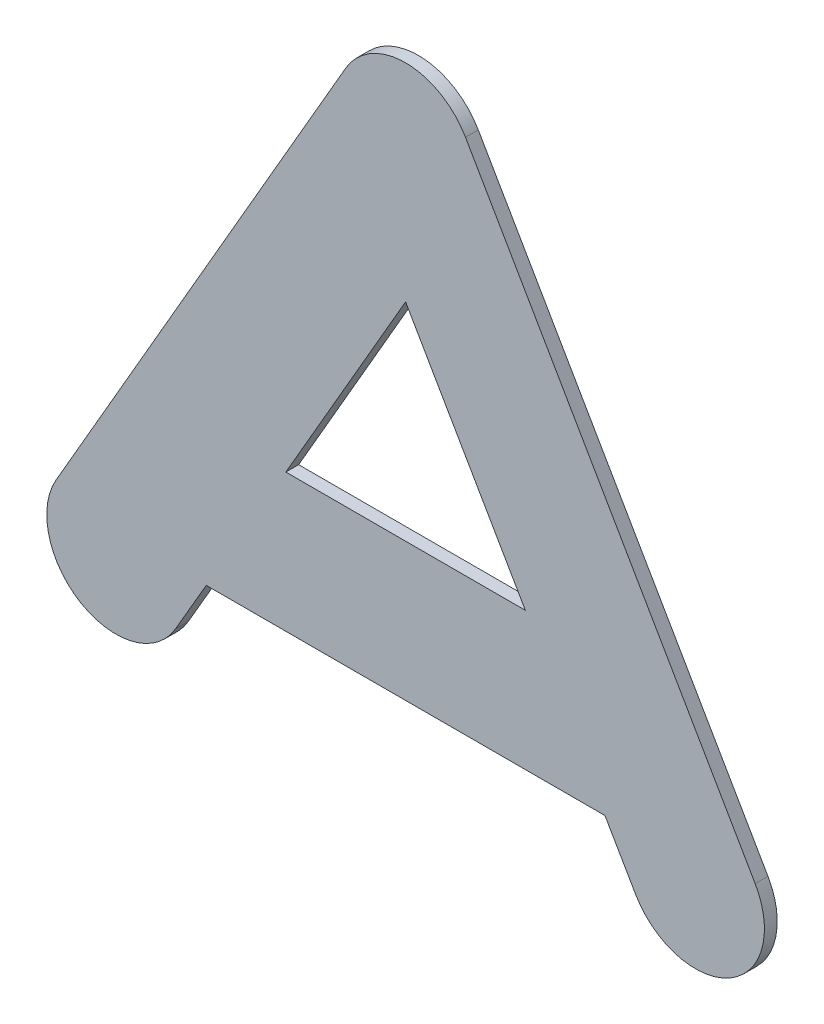
ISO-10303-21;
HEADER;
FILE_DESCRIPTION(('STEP AP214'),'2;1');
FILE_NAME('part.step','',(''),(''),'','','');
FILE_SCHEMA(('AUTOMOTIVE_DESIGN { 1 0 10303 214 1 1 1 1 }'));
ENDSEC;
DATA;
#1=APPLICATION_CONTEXT('core data for automotive mechanical design processes');
#2=APPLICATION_PROTOCOL_DEFINITION('international standard','automotive_design',2000,#1);
#3=PRODUCT_CONTEXT('',#1,'mechanical');
#4=PRODUCT('Part','Part','',(#3));
#5=PRODUCT_RELATED_PRODUCT_CATEGORY('part','',(#4));
#6=PRODUCT_DEFINITION_FORMATION('','',#4);
#7=PRODUCT_DEFINITION_CONTEXT('part definition',#1,'design');
#8=PRODUCT_DEFINITION('design','',#6,#7);
#9=PRODUCT_DEFINITION_SHAPE('','',#8);
#10=(LENGTH_UNIT() NAMED_UNIT(*) SI_UNIT(.MILLI.,.METRE.));
#11=(NAMED_UNIT(*) PLANE_ANGLE_UNIT() SI_UNIT($,.RADIAN.));
#12=(NAMED_UNIT(*) SI_UNIT($,.STERADIAN.) SOLID_ANGLE_UNIT());
#13=UNCERTAINTY_MEASURE_WITH_UNIT(LENGTH_MEASURE(1.E-05),#10,'distance_accuracy_value','');
#14=(GEOMETRIC_REPRESENTATION_CONTEXT(3) GLOBAL_UNCERTAINTY_ASSIGNED_CONTEXT((#13)) GLOBAL_UNIT_ASSIGNED_CONTEXT((#10,
#11,#12)) REPRESENTATION_CONTEXT('',''));
#15=CARTESIAN_POINT('',(0.,0.,0.));
#16=DIRECTION('',(0.,0.,1.));
#17=DIRECTION('',(1.,0.,0.));
#18=AXIS2_PLACEMENT_3D('',#15,#16,#17);
#19=CARTESIAN_POINT('',(0.,0.,0.05));
#20=DIRECTION('',(0.,0.,1.));
#21=DIRECTION('',(1.,0.,0.));
#22=AXIS2_PLACEMENT_3D('',#19,#20,#21);
#23=PLANE('',#22);
#24=DIRECTION('',(0.500277597874586,-0.865865073244576,0.));
#25=VECTOR('',#24,1.);
#26=CARTESIAN_POINT('',(0.,2.698,0.05));
#27=LINE('',#26,#25);
#28=CARTESIAN_POINT('',(0.46799999999999,1.88799999999999,0.05));
#29=VERTEX_POINT('',#28);
#30=CARTESIAN_POINT('',(0.,2.69800000000001,0.05));
#31=VERTEX_POINT('',#30);
#32=EDGE_CURVE('E178',#29,#31,#27,.F.);
#33=ORIENTED_EDGE('',*,*,#32,.F.);
#34=DIRECTION('',(1.,0.,0.));
#35=VECTOR('',#34,1.);
#36=CARTESIAN_POINT('',(0.468,1.888,0.05));
#37=LINE('',#36,#35);
#38=CARTESIAN_POINT('',(-0.468,1.888,0.05));
#39=VERTEX_POINT('',#38);
#40=EDGE_CURVE('E187',#39,#29,#37,.T.);
#41=ORIENTED_EDGE('',*,*,#40,.F.);
#42=DIRECTION('',(0.500277597874586,0.865865073244576,0.));
#43=VECTOR('',#42,1.);
#44=CARTESIAN_POINT('',(-0.468,1.888,0.05));
#45=LINE('',#44,#43);
#46=EDGE_CURVE('E185',#31,#39,#45,.F.);
#47=ORIENTED_EDGE('',*,*,#46,.F.);
#48=EDGE_LOOP('',(#33,#41,#47));
#49=FACE_BOUND('',#48,.T.);
#50=DIRECTION('',(0.501530435631904,0.865140001465007,0.));
#51=VECTOR('',#50,1.);
#52=CARTESIAN_POINT('',(-0.899,1.142,0.05));
#53=LINE('',#52,#51);
#54=CARTESIAN_POINT('',(-0.778999999999998,1.349,0.05));
#55=VERTEX_POINT('',#54);
#56=CARTESIAN_POINT('',(-0.899,1.142,0.05));
#57=VERTEX_POINT('',#56);
#58=EDGE_CURVE('E129',#55,#57,#53,.F.);
#59=ORIENTED_EDGE('',*,*,#58,.F.);
#60=DIRECTION('',(1.,0.,0.));
#61=VECTOR('',#60,1.);
#62=CARTESIAN_POINT('',(-0.779,1.349,0.05));
#63=LINE('',#62,#61);
#64=CARTESIAN_POINT('',(0.779,1.349,0.05));
#65=VERTEX_POINT('',#64);
#66=EDGE_CURVE('E113',#65,#55,#63,.F.);
#67=ORIENTED_EDGE('',*,*,#66,.F.);
#68=DIRECTION('',(0.501530435631904,-0.865140001465007,0.));
#69=VECTOR('',#68,1.);
#70=CARTESIAN_POINT('',(0.779,1.349,0.05));
#71=LINE('',#70,#69);
#72=CARTESIAN_POINT('',(0.898999999999976,1.14199999999999,0.05));
#73=VERTEX_POINT('',#72);
#74=EDGE_CURVE('E111',#73,#65,#71,.F.);
#75=ORIENTED_EDGE('',*,*,#74,.F.);
#76=CARTESIAN_POINT('',(1.1325,1.277,0.05));
#77=DIRECTION('',(0.,0.,1.));
#78=DIRECTION('',(1.,0.,0.));
#79=AXIS2_PLACEMENT_3D('',#76,#77,#78);
#80=CIRCLE('',#79,0.2697169812971);
#81=CARTESIAN_POINT('',(1.366,1.412,0.05));
#82=VERTEX_POINT('',#81);
#83=EDGE_CURVE('E20',#82,#73,#80,.F.);
#84=ORIENTED_EDGE('',*,*,#83,.F.);
#85=DIRECTION('',(-0.500130374739819,0.865950118807433,0.));
#86=VECTOR('',#85,1.);
#87=CARTESIAN_POINT('',(1.366,1.412,0.05));
#88=LINE('',#87,#86);
#89=CARTESIAN_POINT('',(0.234000000000071,3.37200000000004,0.05));
#90=VERTEX_POINT('',#89);
#91=EDGE_CURVE('E96',#90,#82,#88,.F.);
#92=ORIENTED_EDGE('',*,*,#91,.F.);
#93=CARTESIAN_POINT('',(0.,3.236899911029,0.05));
#94=DIRECTION('',(0.,0.,1.));
#95=DIRECTION('',(1.,0.,0.));
#96=AXIS2_PLACEMENT_3D('',#93,#94,#95);
#97=CIRCLE('',#96,0.2701999889712);
#98=CARTESIAN_POINT('',(-0.234,3.372,0.05));
#99=VERTEX_POINT('',#98);
#100=EDGE_CURVE('E157',#99,#90,#97,.F.);
#101=ORIENTED_EDGE('',*,*,#100,.F.);
#102=DIRECTION('',(-0.500130374739819,-0.865950118807433,0.));
#103=VECTOR('',#102,1.);
#104=CARTESIAN_POINT('',(-0.234,3.372,0.05));
#105=LINE('',#104,#103);
#106=CARTESIAN_POINT('',(-1.36600000000003,1.41200000000002,0.05));
#107=VERTEX_POINT('',#106);
#108=EDGE_CURVE('E138',#107,#99,#105,.F.);
#109=ORIENTED_EDGE('',*,*,#108,.F.);
#110=CARTESIAN_POINT('',(-1.1325,1.277,0.05));
#111=DIRECTION('',(0.,0.,1.));
#112=DIRECTION('',(1.,0.,0.));
#113=AXIS2_PLACEMENT_3D('',#110,#111,#112);
#114=CIRCLE('',#113,0.2697169812971);
#115=EDGE_CURVE('E155',#57,#107,#114,.F.);
#116=ORIENTED_EDGE('',*,*,#115,.F.);
#117=EDGE_LOOP('',(#59,#67,#75,#84,#92,#101,#109,#116));
#118=FACE_BOUND('',#117,.T.);
#119=ADVANCED_FACE('F17',(#49,#118),#23,.T.);
#120=CARTESIAN_POINT('',(-0.779,1.349,0.));
#121=DIRECTION('',(0.,-1.,0.));
#122=DIRECTION('',(0.,0.,-1.));
#123=AXIS2_PLACEMENT_3D('',#120,#121,#122);
#124=PLANE('',#123);
#125=DIRECTION('',(0.,0.,1.));
#126=VECTOR('',#125,1.);
#127=CARTESIAN_POINT('',(-0.778999999999997,1.349,0.));
#128=LINE('',#127,#126);
#129=CARTESIAN_POINT('',(-0.778999999999999,1.349,0.));
#130=VERTEX_POINT('',#129);
#131=EDGE_CURVE('E132',#130,#55,#128,.T.);
#132=ORIENTED_EDGE('',*,*,#131,.F.);
#133=DIRECTION('',(1.,0.,0.));
#134=VECTOR('',#133,1.);
#135=CARTESIAN_POINT('',(0.,1.349,0.));
#136=LINE('',#135,#134);
#137=CARTESIAN_POINT('',(0.779,1.349,0.));
#138=VERTEX_POINT('',#137);
#139=EDGE_CURVE('E174',#130,#138,#136,.T.);
#140=ORIENTED_EDGE('',*,*,#139,.T.);
#141=DIRECTION('',(0.,0.,1.));
#142=VECTOR('',#141,1.);
#143=CARTESIAN_POINT('',(0.779,1.349,0.));
#144=LINE('',#143,#142);
#145=EDGE_CURVE('E109',#65,#138,#144,.F.);
#146=ORIENTED_EDGE('',*,*,#145,.F.);
#147=ORIENTED_EDGE('',*,*,#66,.T.);
#148=EDGE_LOOP('',(#132,#140,#146,#147));
#149=FACE_BOUND('',#148,.T.);
#150=ADVANCED_FACE('F247',(#149),#124,.T.);
#151=CARTESIAN_POINT('',(0.779,1.349,0.));
#152=DIRECTION('',(-0.865140001465007,-0.501530435631904,0.));
#153=DIRECTION('',(0.501530435631904,-0.865140001465007,0.));
#154=AXIS2_PLACEMENT_3D('',#151,#152,#153);
#155=PLANE('',#154);
#156=ORIENTED_EDGE('',*,*,#145,.T.);
#157=DIRECTION('',(0.501530435631892,-0.865140001465014,0.));
#158=VECTOR('',#157,1.);
#159=CARTESIAN_POINT('',(0.779,1.349,0.));
#160=LINE('',#159,#158);
#161=CARTESIAN_POINT('',(0.898999999999976,1.14199999999999,0.));
#162=VERTEX_POINT('',#161);
#163=EDGE_CURVE('E120',#138,#162,#160,.T.);
#164=ORIENTED_EDGE('',*,*,#163,.T.);
#165=DIRECTION('',(0.,0.,1.));
#166=VECTOR('',#165,1.);
#167=CARTESIAN_POINT('',(0.898999999999967,1.14199999999998,0.));
#168=LINE('',#167,#166);
#169=EDGE_CURVE('E105',#73,#162,#168,.F.);
#170=ORIENTED_EDGE('',*,*,#169,.F.);
#171=ORIENTED_EDGE('',*,*,#74,.T.);
#172=EDGE_LOOP('',(#156,#164,#170,#171));
#173=FACE_BOUND('',#172,.T.);
#174=ADVANCED_FACE('F118',(#173),#155,.T.);
#175=CARTESIAN_POINT('',(1.1325,1.277,0.));
#176=DIRECTION('',(0.,0.,1.));
#177=DIRECTION('',(1.,0.,0.));
#178=AXIS2_PLACEMENT_3D('',#175,#176,#177);
#179=CYLINDRICAL_SURFACE('',#178,0.2697169812971);
#180=ORIENTED_EDGE('',*,*,#169,.T.);
#181=CARTESIAN_POINT('',(1.1325,1.277,0.));
#182=DIRECTION('',(0.,0.,1.));
#183=DIRECTION('',(1.,0.,0.));
#184=AXIS2_PLACEMENT_3D('',#181,#182,#183);
#185=CIRCLE('',#184,0.2697169812971);
#186=CARTESIAN_POINT('',(1.366,1.412,0.));
#187=VERTEX_POINT('',#186);
#188=EDGE_CURVE('E153',#162,#187,#185,.T.);
#189=ORIENTED_EDGE('',*,*,#188,.T.);
#190=DIRECTION('',(0.,0.,1.));
#191=VECTOR('',#190,1.);
#192=CARTESIAN_POINT('',(1.366,1.412,0.));
#193=LINE('',#192,#191);
#194=EDGE_CURVE('E107',#82,#187,#193,.F.);
#195=ORIENTED_EDGE('',*,*,#194,.F.);
#196=ORIENTED_EDGE('',*,*,#83,.T.);
#197=EDGE_LOOP('',(#180,#189,#195,#196));
#198=FACE_BOUND('',#197,.T.);
#199=ADVANCED_FACE('F102',(#198),#179,.T.);
#200=CARTESIAN_POINT('',(1.366,1.412,0.));
#201=DIRECTION('',(0.865950118807433,0.500130374739819,0.));
#202=DIRECTION('',(-0.500130374739819,0.865950118807433,0.));
#203=AXIS2_PLACEMENT_3D('',#200,#201,#202);
#204=PLANE('',#203);
#205=ORIENTED_EDGE('',*,*,#194,.T.);
#206=DIRECTION('',(-0.500130374739807,0.86595011880744,0.));
#207=VECTOR('',#206,1.);
#208=CARTESIAN_POINT('',(1.366,1.412,0.));
#209=LINE('',#208,#207);
#210=CARTESIAN_POINT('',(0.234000000000077,3.37200000000005,0.));
#211=VERTEX_POINT('',#210);
#212=EDGE_CURVE('E152',#187,#211,#209,.T.);
#213=ORIENTED_EDGE('',*,*,#212,.T.);
#214=DIRECTION('',(0.,0.,1.));
#215=VECTOR('',#214,1.);
#216=CARTESIAN_POINT('',(0.234000000000103,3.37200000000006,0.));
#217=LINE('',#216,#215);
#218=EDGE_CURVE('E140',#90,#211,#217,.F.);
#219=ORIENTED_EDGE('',*,*,#218,.F.);
#220=ORIENTED_EDGE('',*,*,#91,.T.);
#221=EDGE_LOOP('',(#205,#213,#219,#220));
#222=FACE_BOUND('',#221,.T.);
#223=ADVANCED_FACE('F163',(#222),#204,.T.);
#224=CARTESIAN_POINT('',(0.,3.236899911029,0.));
#225=DIRECTION('',(0.,0.,1.));
#226=DIRECTION('',(1.,0.,0.));
#227=AXIS2_PLACEMENT_3D('',#224,#225,#226);
#228=CYLINDRICAL_SURFACE('',#227,0.2701999889712);
#229=ORIENTED_EDGE('',*,*,#218,.T.);
#230=CARTESIAN_POINT('',(0.,3.236899911029,0.));
#231=DIRECTION('',(0.,0.,1.));
#232=DIRECTION('',(1.,0.,0.));
#233=AXIS2_PLACEMENT_3D('',#230,#231,#232);
#234=CIRCLE('',#233,0.2701999889712);
#235=CARTESIAN_POINT('',(-0.234,3.372,0.));
#236=VERTEX_POINT('',#235);
#237=EDGE_CURVE('E149',#211,#236,#234,.T.);
#238=ORIENTED_EDGE('',*,*,#237,.T.);
#239=DIRECTION('',(0.,0.,1.));
#240=VECTOR('',#239,1.);
#241=CARTESIAN_POINT('',(-0.234,3.372,0.));
#242=LINE('',#241,#240);
#243=EDGE_CURVE('E139',#99,#236,#242,.F.);
#244=ORIENTED_EDGE('',*,*,#243,.F.);
#245=ORIENTED_EDGE('',*,*,#100,.T.);
#246=EDGE_LOOP('',(#229,#238,#244,#245));
#247=FACE_BOUND('',#246,.T.);
#248=ADVANCED_FACE('F205',(#247),#228,.T.);
#249=CARTESIAN_POINT('',(-0.234,3.372,0.));
#250=DIRECTION('',(-0.865950118807433,0.500130374739819,0.));
#251=DIRECTION('',(-0.500130374739819,-0.865950118807433,0.));
#252=AXIS2_PLACEMENT_3D('',#249,#250,#251);
#253=PLANE('',#252);
#254=ORIENTED_EDGE('',*,*,#243,.T.);
#255=DIRECTION('',(-0.500130374739807,-0.86595011880744,0.));
#256=VECTOR('',#255,1.);
#257=CARTESIAN_POINT('',(-0.234,3.372,0.));
#258=LINE('',#257,#256);
#259=CARTESIAN_POINT('',(-1.36600000000002,1.41200000000001,0.));
#260=VERTEX_POINT('',#259);
#261=EDGE_CURVE('E148',#236,#260,#258,.T.);
#262=ORIENTED_EDGE('',*,*,#261,.T.);
#263=DIRECTION('',(0.,0.,1.));
#264=VECTOR('',#263,1.);
#265=CARTESIAN_POINT('',(-1.36600000000003,1.41200000000002,0.));
#266=LINE('',#265,#264);
#267=EDGE_CURVE('E156',#107,#260,#266,.F.);
#268=ORIENTED_EDGE('',*,*,#267,.F.);
#269=ORIENTED_EDGE('',*,*,#108,.T.);
#270=EDGE_LOOP('',(#254,#262,#268,#269));
#271=FACE_BOUND('',#270,.T.);
#272=ADVANCED_FACE('F201',(#271),#253,.T.);
#273=CARTESIAN_POINT('',(-1.1325,1.277,0.));
#274=DIRECTION('',(0.,0.,1.));
#275=DIRECTION('',(1.,0.,0.));
#276=AXIS2_PLACEMENT_3D('',#273,#274,#275);
#277=CYLINDRICAL_SURFACE('',#276,0.2697169812971);
#278=ORIENTED_EDGE('',*,*,#267,.T.);
#279=CARTESIAN_POINT('',(-1.1325,1.277,0.));
#280=DIRECTION('',(0.,0.,1.));
#281=DIRECTION('',(1.,0.,0.));
#282=AXIS2_PLACEMENT_3D('',#279,#280,#281);
#283=CIRCLE('',#282,0.2697169812971);
#284=CARTESIAN_POINT('',(-0.899,1.142,0.));
#285=VERTEX_POINT('',#284);
#286=EDGE_CURVE('E144',#260,#285,#283,.T.);
#287=ORIENTED_EDGE('',*,*,#286,.T.);
#288=DIRECTION('',(0.,0.,1.));
#289=VECTOR('',#288,1.);
#290=CARTESIAN_POINT('',(-0.899,1.142,0.));
#291=LINE('',#290,#289);
#292=EDGE_CURVE('E131',#57,#285,#291,.F.);
#293=ORIENTED_EDGE('',*,*,#292,.F.);
#294=ORIENTED_EDGE('',*,*,#115,.T.);
#295=EDGE_LOOP('',(#278,#287,#293,#294));
#296=FACE_BOUND('',#295,.T.);
#297=ADVANCED_FACE('F213',(#296),#277,.T.);
#298=CARTESIAN_POINT('',(-0.899,1.142,0.));
#299=DIRECTION('',(0.865140001465007,-0.501530435631904,0.));
#300=DIRECTION('',(0.501530435631904,0.865140001465007,0.));
#301=AXIS2_PLACEMENT_3D('',#298,#299,#300);
#302=PLANE('',#301);
#303=ORIENTED_EDGE('',*,*,#292,.T.);
#304=DIRECTION('',(0.501530435631892,0.865140001465014,0.));
#305=VECTOR('',#304,1.);
#306=CARTESIAN_POINT('',(-0.899,1.142,0.));
#307=LINE('',#306,#305);
#308=EDGE_CURVE('E147',#285,#130,#307,.T.);
#309=ORIENTED_EDGE('',*,*,#308,.T.);
#310=ORIENTED_EDGE('',*,*,#131,.T.);
#311=ORIENTED_EDGE('',*,*,#58,.T.);
#312=EDGE_LOOP('',(#303,#309,#310,#311));
#313=FACE_BOUND('',#312,.T.);
#314=ADVANCED_FACE('F233',(#313),#302,.T.);
#315=CARTESIAN_POINT('',(0.468,1.888,0.));
#316=DIRECTION('',(0.,1.,0.));
#317=DIRECTION('',(0.,0.,1.));
#318=AXIS2_PLACEMENT_3D('',#315,#316,#317);
#319=PLANE('',#318);
#320=DIRECTION('',(0.,0.,1.));
#321=VECTOR('',#320,1.);
#322=CARTESIAN_POINT('',(0.46799999999996,1.88799999999998,0.));
#323=LINE('',#322,#321);
#324=CARTESIAN_POINT('',(0.46799999999999,1.88799999999999,0.));
#325=VERTEX_POINT('',#324);
#326=EDGE_CURVE('E180',#325,#29,#323,.T.);
#327=ORIENTED_EDGE('',*,*,#326,.F.);
#328=DIRECTION('',(1.,0.,0.));
#329=VECTOR('',#328,1.);
#330=CARTESIAN_POINT('',(0.,1.888,0.));
#331=LINE('',#330,#329);
#332=CARTESIAN_POINT('',(-0.468,1.888,0.));
#333=VERTEX_POINT('',#332);
#334=EDGE_CURVE('E248',#325,#333,#331,.F.);
#335=ORIENTED_EDGE('',*,*,#334,.T.);
#336=DIRECTION('',(0.,0.,1.));
#337=VECTOR('',#336,1.);
#338=CARTESIAN_POINT('',(-0.468,1.888,0.));
#339=LINE('',#338,#337);
#340=EDGE_CURVE('E183',#39,#333,#339,.F.);
#341=ORIENTED_EDGE('',*,*,#340,.F.);
#342=ORIENTED_EDGE('',*,*,#40,.T.);
#343=EDGE_LOOP('',(#327,#335,#341,#342));
#344=FACE_BOUND('',#343,.T.);
#345=ADVANCED_FACE('F229',(#344),#319,.T.);
#346=CARTESIAN_POINT('',(-0.468,1.888,0.));
#347=DIRECTION('',(0.865865073244576,-0.500277597874586,0.));
#348=DIRECTION('',(0.500277597874586,0.865865073244576,0.));
#349=AXIS2_PLACEMENT_3D('',#346,#347,#348);
#350=PLANE('',#349);
#351=ORIENTED_EDGE('',*,*,#340,.T.);
#352=DIRECTION('',(0.500277597874629,0.865865073244551,0.));
#353=VECTOR('',#352,1.);
#354=CARTESIAN_POINT('',(-0.468,1.888,0.));
#355=LINE('',#354,#353);
#356=CARTESIAN_POINT('',(0.,2.69800000000001,0.));
#357=VERTEX_POINT('',#356);
#358=EDGE_CURVE('E26',#333,#357,#355,.T.);
#359=ORIENTED_EDGE('',*,*,#358,.T.);
#360=DIRECTION('',(0.,0.,1.));
#361=VECTOR('',#360,1.);
#362=CARTESIAN_POINT('',(0.,2.698,0.));
#363=LINE('',#362,#361);
#364=EDGE_CURVE('E34',#31,#357,#363,.F.);
#365=ORIENTED_EDGE('',*,*,#364,.F.);
#366=ORIENTED_EDGE('',*,*,#46,.T.);
#367=EDGE_LOOP('',(#351,#359,#365,#366));
#368=FACE_BOUND('',#367,.T.);
#369=ADVANCED_FACE('F223',(#368),#350,.T.);
#370=CARTESIAN_POINT('',(0.,2.698,0.));
#371=DIRECTION('',(-0.865865073244576,-0.500277597874586,0.));
#372=DIRECTION('',(0.500277597874586,-0.865865073244576,0.));
#373=AXIS2_PLACEMENT_3D('',#370,#371,#372);
#374=PLANE('',#373);
#375=ORIENTED_EDGE('',*,*,#364,.T.);
#376=DIRECTION('',(0.500277597874629,-0.865865073244551,0.));
#377=VECTOR('',#376,1.);
#378=CARTESIAN_POINT('',(0.,2.698,0.));
#379=LINE('',#378,#377);
#380=EDGE_CURVE('E11',#357,#325,#379,.T.);
#381=ORIENTED_EDGE('',*,*,#380,.T.);
#382=ORIENTED_EDGE('',*,*,#326,.T.);
#383=ORIENTED_EDGE('',*,*,#32,.T.);
#384=EDGE_LOOP('',(#375,#381,#382,#383));
#385=FACE_BOUND('',#384,.T.);
#386=ADVANCED_FACE('F217',(#385),#374,.T.);
#387=CARTESIAN_POINT('',(0.,0.,0.));
#388=DIRECTION('',(0.,0.,1.));
#389=DIRECTION('',(1.,0.,0.));
#390=AXIS2_PLACEMENT_3D('',#387,#388,#389);
#391=PLANE('',#390);
#392=ORIENTED_EDGE('',*,*,#358,.F.);
#393=ORIENTED_EDGE('',*,*,#334,.F.);
#394=ORIENTED_EDGE('',*,*,#380,.F.);
#395=EDGE_LOOP('',(#392,#393,#394));
#396=FACE_BOUND('',#395,.T.);
#397=ORIENTED_EDGE('',*,*,#286,.F.);
#398=ORIENTED_EDGE('',*,*,#261,.F.);
#399=ORIENTED_EDGE('',*,*,#237,.F.);
#400=ORIENTED_EDGE('',*,*,#212,.F.);
#401=ORIENTED_EDGE('',*,*,#188,.F.);
#402=ORIENTED_EDGE('',*,*,#163,.F.);
#403=ORIENTED_EDGE('',*,*,#139,.F.);
#404=ORIENTED_EDGE('',*,*,#308,.F.);
#405=EDGE_LOOP('',(#397,#398,#399,#400,#401,#402,#403,#404));
#406=FACE_BOUND('',#405,.T.);
#407=ADVANCED_FACE('F167',(#396,#406),#391,.F.);
#408=CLOSED_SHELL('',(#119,#150,#174,#199,#223,#248,#272,#297,#314,#345,#369,#386,#407));
#409=MANIFOLD_SOLID_BREP('B1',#408);
#410=ADVANCED_BREP_SHAPE_REPRESENTATION('',(#18,#409),#14);
#411=SHAPE_DEFINITION_REPRESENTATION(#9,#410);
ENDSEC;
END-ISO-10303-21;
